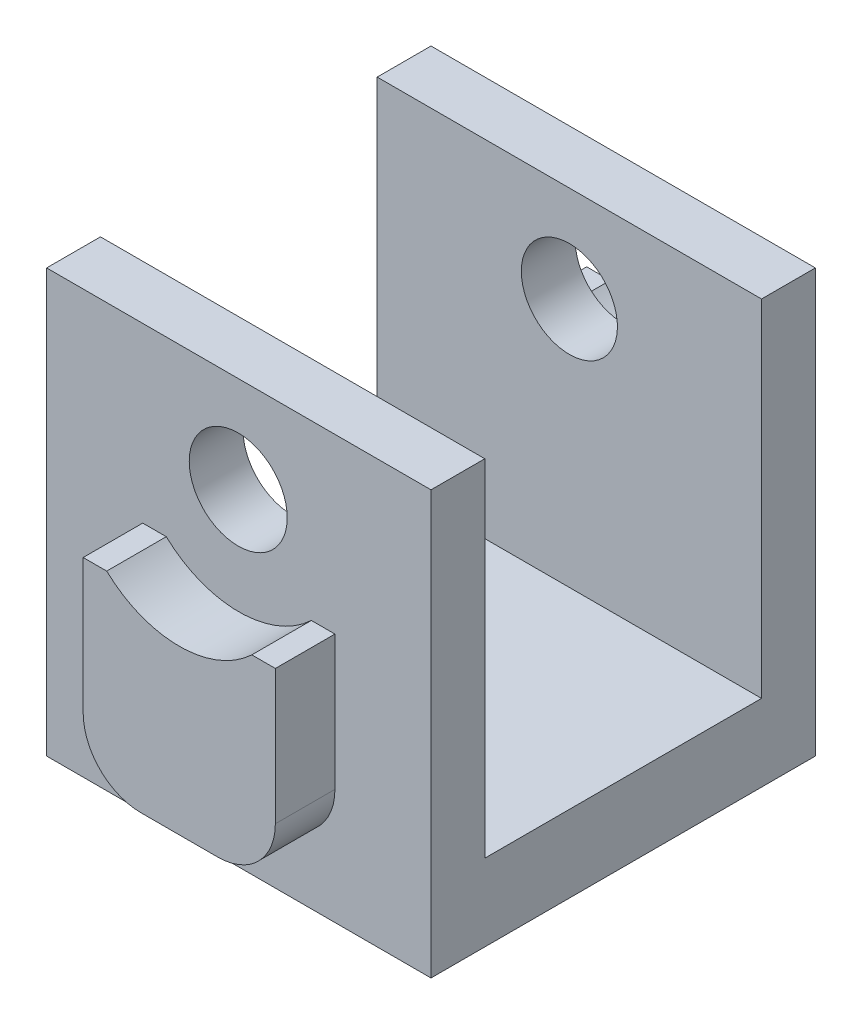
ISO-10303-21;
HEADER;
FILE_DESCRIPTION(('STEP AP214'),'2;1');
FILE_NAME('part.step','',(''),(''),'','','');
FILE_SCHEMA(('AUTOMOTIVE_DESIGN { 1 0 10303 214 1 1 1 1 }'));
ENDSEC;
DATA;
#1=APPLICATION_CONTEXT('core data for automotive mechanical design processes');
#2=APPLICATION_PROTOCOL_DEFINITION('international standard','automotive_design',2000,#1);
#3=PRODUCT_CONTEXT('',#1,'mechanical');
#4=PRODUCT('Part','Part','',(#3));
#5=PRODUCT_RELATED_PRODUCT_CATEGORY('part','',(#4));
#6=PRODUCT_DEFINITION_FORMATION('','',#4);
#7=PRODUCT_DEFINITION_CONTEXT('part definition',#1,'design');
#8=PRODUCT_DEFINITION('design','',#6,#7);
#9=PRODUCT_DEFINITION_SHAPE('','',#8);
#10=(LENGTH_UNIT() NAMED_UNIT(*) SI_UNIT(.MILLI.,.METRE.));
#11=(NAMED_UNIT(*) PLANE_ANGLE_UNIT() SI_UNIT($,.RADIAN.));
#12=(NAMED_UNIT(*) SI_UNIT($,.STERADIAN.) SOLID_ANGLE_UNIT());
#13=UNCERTAINTY_MEASURE_WITH_UNIT(LENGTH_MEASURE(1.E-05),#10,'distance_accuracy_value','');
#14=(GEOMETRIC_REPRESENTATION_CONTEXT(3) GLOBAL_UNCERTAINTY_ASSIGNED_CONTEXT((#13)) GLOBAL_UNIT_ASSIGNED_CONTEXT((#10,
#11,#12)) REPRESENTATION_CONTEXT('',''));
#15=CARTESIAN_POINT('',(0.,0.,0.));
#16=DIRECTION('',(0.,0.,1.));
#17=DIRECTION('',(1.,0.,0.));
#18=AXIS2_PLACEMENT_3D('',#15,#16,#17);
#19=CARTESIAN_POINT('',(10.1,32.,26.));
#20=DIRECTION('',(0.,0.,-1.));
#21=DIRECTION('',(-1.,0.,0.));
#22=AXIS2_PLACEMENT_3D('',#19,#20,#21);
#23=CYLINDRICAL_SURFACE('',#22,5.5);
#24=CARTESIAN_POINT('',(10.1,32.,22.9));
#25=DIRECTION('',(0.,0.,-1.));
#26=DIRECTION('',(1.,0.,0.));
#27=AXIS2_PLACEMENT_3D('',#24,#25,#26);
#28=CIRCLE('',#27,5.5);
#29=CARTESIAN_POINT('',(13.8749172176354,28.,22.9));
#30=VERTEX_POINT('',#29);
#31=CARTESIAN_POINT('',(6.32508278236463,28.,22.9));
#32=VERTEX_POINT('',#31);
#33=EDGE_CURVE('E133',#30,#32,#28,.T.);
#34=ORIENTED_EDGE('',*,*,#33,.T.);
#35=DIRECTION('',(0.,0.,-1.));
#36=VECTOR('',#35,1.);
#37=CARTESIAN_POINT('',(6.32508278236463,28.,26.));
#38=LINE('',#37,#36);
#39=CARTESIAN_POINT('',(6.32508278236463,28.,26.));
#40=VERTEX_POINT('',#39);
#41=EDGE_CURVE('E115',#40,#32,#38,.T.);
#42=ORIENTED_EDGE('',*,*,#41,.F.);
#43=CARTESIAN_POINT('',(10.1,32.,26.));
#44=DIRECTION('',(0.,0.,-1.));
#45=DIRECTION('',(1.,0.,0.));
#46=AXIS2_PLACEMENT_3D('',#43,#44,#45);
#47=CIRCLE('',#46,5.5);
#48=CARTESIAN_POINT('',(13.8749172176354,28.,26.));
#49=VERTEX_POINT('',#48);
#50=EDGE_CURVE('E121',#49,#40,#47,.T.);
#51=ORIENTED_EDGE('',*,*,#50,.F.);
#52=DIRECTION('',(0.,0.,-1.));
#53=VECTOR('',#52,1.);
#54=CARTESIAN_POINT('',(13.8749172176354,28.,26.));
#55=LINE('',#54,#53);
#56=EDGE_CURVE('E180',#49,#30,#55,.T.);
#57=ORIENTED_EDGE('',*,*,#56,.T.);
#58=EDGE_LOOP('',(#34,#42,#51,#57));
#59=FACE_BOUND('',#58,.T.);
#60=ADVANCED_FACE('F44',(#59),#23,.F.);
#61=CARTESIAN_POINT('',(5.1,28.,26.));
#62=DIRECTION('',(0.,-1.,0.));
#63=DIRECTION('',(1.,0.,0.));
#64=AXIS2_PLACEMENT_3D('',#61,#62,#63);
#65=PLANE('',#64);
#66=DIRECTION('',(-1.,0.,0.));
#67=VECTOR('',#66,1.);
#68=CARTESIAN_POINT('',(5.1,28.,22.9));
#69=LINE('',#68,#67);
#70=CARTESIAN_POINT('',(5.1,28.,22.9));
#71=VERTEX_POINT('',#70);
#72=EDGE_CURVE('E175',#32,#71,#69,.T.);
#73=ORIENTED_EDGE('',*,*,#72,.T.);
#74=DIRECTION('',(0.,0.,-1.));
#75=VECTOR('',#74,1.);
#76=CARTESIAN_POINT('',(5.1,28.,26.));
#77=LINE('',#76,#75);
#78=CARTESIAN_POINT('',(5.1,28.,26.));
#79=VERTEX_POINT('',#78);
#80=EDGE_CURVE('E118',#79,#71,#77,.T.);
#81=ORIENTED_EDGE('',*,*,#80,.F.);
#82=DIRECTION('',(-1.,0.,0.));
#83=VECTOR('',#82,1.);
#84=CARTESIAN_POINT('',(5.1,28.,26.));
#85=LINE('',#84,#83);
#86=EDGE_CURVE('E111',#40,#79,#85,.T.);
#87=ORIENTED_EDGE('',*,*,#86,.F.);
#88=ORIENTED_EDGE('',*,*,#41,.T.);
#89=EDGE_LOOP('',(#73,#81,#87,#88));
#90=FACE_BOUND('',#89,.T.);
#91=ADVANCED_FACE('F113',(#90),#65,.F.);
#92=CARTESIAN_POINT('',(5.1,18.,26.));
#93=DIRECTION('',(1.,0.,0.));
#94=DIRECTION('',(0.,1.,0.));
#95=AXIS2_PLACEMENT_3D('',#92,#93,#94);
#96=PLANE('',#95);
#97=DIRECTION('',(0.,-1.,0.));
#98=VECTOR('',#97,1.);
#99=CARTESIAN_POINT('',(5.1,18.,22.9));
#100=LINE('',#99,#98);
#101=CARTESIAN_POINT('',(5.1,21.,22.9));
#102=VERTEX_POINT('',#101);
#103=EDGE_CURVE('E172',#71,#102,#100,.T.);
#104=ORIENTED_EDGE('',*,*,#103,.T.);
#105=DIRECTION('',(0.,0.,-1.));
#106=VECTOR('',#105,1.);
#107=CARTESIAN_POINT('',(5.1,21.,26.));
#108=LINE('',#107,#106);
#109=CARTESIAN_POINT('',(5.1,21.,26.));
#110=VERTEX_POINT('',#109);
#111=EDGE_CURVE('E12',#102,#110,#108,.F.);
#112=ORIENTED_EDGE('',*,*,#111,.T.);
#113=DIRECTION('',(0.,-1.,0.));
#114=VECTOR('',#113,1.);
#115=CARTESIAN_POINT('',(5.1,18.,26.));
#116=LINE('',#115,#114);
#117=EDGE_CURVE('E120',#79,#110,#116,.T.);
#118=ORIENTED_EDGE('',*,*,#117,.F.);
#119=ORIENTED_EDGE('',*,*,#80,.T.);
#120=EDGE_LOOP('',(#104,#112,#118,#119));
#121=FACE_BOUND('',#120,.T.);
#122=ADVANCED_FACE('F190',(#121),#96,.F.);
#123=CARTESIAN_POINT('',(15.1,18.,26.));
#124=DIRECTION('',(0.,1.,0.));
#125=DIRECTION('',(0.,0.,1.));
#126=AXIS2_PLACEMENT_3D('',#123,#124,#125);
#127=PLANE('',#126);
#128=DIRECTION('',(1.,0.,0.));
#129=VECTOR('',#128,1.);
#130=CARTESIAN_POINT('',(15.1,18.,22.9));
#131=LINE('',#130,#129);
#132=CARTESIAN_POINT('',(8.1,18.,22.9));
#133=VERTEX_POINT('',#132);
#134=CARTESIAN_POINT('',(12.1,18.,22.9));
#135=VERTEX_POINT('',#134);
#136=EDGE_CURVE('E167',#133,#135,#131,.T.);
#137=ORIENTED_EDGE('',*,*,#136,.T.);
#138=DIRECTION('',(0.,0.,-1.));
#139=VECTOR('',#138,1.);
#140=CARTESIAN_POINT('',(12.1,18.,26.));
#141=LINE('',#140,#139);
#142=CARTESIAN_POINT('',(12.1,18.,26.));
#143=VERTEX_POINT('',#142);
#144=EDGE_CURVE('E65',#135,#143,#141,.F.);
#145=ORIENTED_EDGE('',*,*,#144,.T.);
#146=DIRECTION('',(1.,0.,0.));
#147=VECTOR('',#146,1.);
#148=CARTESIAN_POINT('',(15.1,18.,26.));
#149=LINE('',#148,#147);
#150=CARTESIAN_POINT('',(8.1,18.,26.));
#151=VERTEX_POINT('',#150);
#152=EDGE_CURVE('E155',#151,#143,#149,.T.);
#153=ORIENTED_EDGE('',*,*,#152,.F.);
#154=DIRECTION('',(0.,0.,-1.));
#155=VECTOR('',#154,1.);
#156=CARTESIAN_POINT('',(8.1,18.,26.));
#157=LINE('',#156,#155);
#158=EDGE_CURVE('E146',#151,#133,#157,.T.);
#159=ORIENTED_EDGE('',*,*,#158,.T.);
#160=EDGE_LOOP('',(#137,#145,#153,#159));
#161=FACE_BOUND('',#160,.T.);
#162=ADVANCED_FACE('F170',(#161),#127,.F.);
#163=CARTESIAN_POINT('',(15.1,28.,26.));
#164=DIRECTION('',(-1.,0.,0.));
#165=DIRECTION('',(0.,0.,1.));
#166=AXIS2_PLACEMENT_3D('',#163,#164,#165);
#167=PLANE('',#166);
#168=DIRECTION('',(0.,1.,0.));
#169=VECTOR('',#168,1.);
#170=CARTESIAN_POINT('',(15.1,28.,26.));
#171=LINE('',#170,#169);
#172=CARTESIAN_POINT('',(15.1,21.,26.));
#173=VERTEX_POINT('',#172);
#174=CARTESIAN_POINT('',(15.1,28.,26.));
#175=VERTEX_POINT('',#174);
#176=EDGE_CURVE('E153',#173,#175,#171,.T.);
#177=ORIENTED_EDGE('',*,*,#176,.F.);
#178=DIRECTION('',(0.,0.,-1.));
#179=VECTOR('',#178,1.);
#180=CARTESIAN_POINT('',(15.1,21.,26.));
#181=LINE('',#180,#179);
#182=CARTESIAN_POINT('',(15.1,21.,22.9));
#183=VERTEX_POINT('',#182);
#184=EDGE_CURVE('E134',#173,#183,#181,.T.);
#185=ORIENTED_EDGE('',*,*,#184,.T.);
#186=DIRECTION('',(0.,1.,0.));
#187=VECTOR('',#186,1.);
#188=CARTESIAN_POINT('',(15.1,28.,22.9));
#189=LINE('',#188,#187);
#190=CARTESIAN_POINT('',(15.1,28.,22.9));
#191=VERTEX_POINT('',#190);
#192=EDGE_CURVE('E169',#183,#191,#189,.T.);
#193=ORIENTED_EDGE('',*,*,#192,.T.);
#194=DIRECTION('',(0.,0.,-1.));
#195=VECTOR('',#194,1.);
#196=CARTESIAN_POINT('',(15.1,28.,26.));
#197=LINE('',#196,#195);
#198=EDGE_CURVE('E139',#175,#191,#197,.T.);
#199=ORIENTED_EDGE('',*,*,#198,.F.);
#200=EDGE_LOOP('',(#177,#185,#193,#199));
#201=FACE_BOUND('',#200,.T.);
#202=ADVANCED_FACE('F159',(#201),#167,.F.);
#203=CARTESIAN_POINT('',(13.8749172176354,28.,26.));
#204=DIRECTION('',(0.,-1.,0.));
#205=DIRECTION('',(1.,0.,0.));
#206=AXIS2_PLACEMENT_3D('',#203,#204,#205);
#207=PLANE('',#206);
#208=DIRECTION('',(-1.,0.,0.));
#209=VECTOR('',#208,1.);
#210=CARTESIAN_POINT('',(13.8749172176354,28.,22.9));
#211=LINE('',#210,#209);
#212=EDGE_CURVE('E130',#191,#30,#211,.T.);
#213=ORIENTED_EDGE('',*,*,#212,.T.);
#214=ORIENTED_EDGE('',*,*,#56,.F.);
#215=DIRECTION('',(-1.,0.,0.));
#216=VECTOR('',#215,1.);
#217=CARTESIAN_POINT('',(13.8749172176354,28.,26.));
#218=LINE('',#217,#216);
#219=EDGE_CURVE('E126',#175,#49,#218,.T.);
#220=ORIENTED_EDGE('',*,*,#219,.F.);
#221=ORIENTED_EDGE('',*,*,#198,.T.);
#222=EDGE_LOOP('',(#213,#214,#220,#221));
#223=FACE_BOUND('',#222,.T.);
#224=ADVANCED_FACE('F182',(#223),#207,.F.);
#225=CARTESIAN_POINT('',(10.1,32.,26.));
#226=DIRECTION('',(0.,0.,1.));
#227=DIRECTION('',(1.,0.,0.));
#228=AXIS2_PLACEMENT_3D('',#225,#226,#227);
#229=PLANE('',#228);
#230=ORIENTED_EDGE('',*,*,#152,.T.);
#231=CARTESIAN_POINT('',(12.1,21.,26.));
#232=DIRECTION('',(0.,0.,1.));
#233=DIRECTION('',(1.,0.,0.));
#234=AXIS2_PLACEMENT_3D('',#231,#232,#233);
#235=CIRCLE('',#234,3.);
#236=EDGE_CURVE('E52',#143,#173,#235,.T.);
#237=ORIENTED_EDGE('',*,*,#236,.T.);
#238=ORIENTED_EDGE('',*,*,#176,.T.);
#239=ORIENTED_EDGE('',*,*,#219,.T.);
#240=ORIENTED_EDGE('',*,*,#50,.T.);
#241=ORIENTED_EDGE('',*,*,#86,.T.);
#242=ORIENTED_EDGE('',*,*,#117,.T.);
#243=CARTESIAN_POINT('',(8.1,21.,26.));
#244=DIRECTION('',(0.,0.,1.));
#245=DIRECTION('',(1.,0.,0.));
#246=AXIS2_PLACEMENT_3D('',#243,#244,#245);
#247=CIRCLE('',#246,3.);
#248=EDGE_CURVE('E150',#110,#151,#247,.T.);
#249=ORIENTED_EDGE('',*,*,#248,.T.);
#250=EDGE_LOOP('',(#230,#237,#238,#239,#240,#241,#242,#249));
#251=FACE_BOUND('',#250,.T.);
#252=ADVANCED_FACE('F124',(#251),#229,.T.);
#253=CARTESIAN_POINT('',(10.1,32.,22.9));
#254=DIRECTION('',(0.,0.,1.));
#255=DIRECTION('',(1.,0.,0.));
#256=AXIS2_PLACEMENT_3D('',#253,#254,#255);
#257=PLANE('',#256);
#258=ORIENTED_EDGE('',*,*,#192,.F.);
#259=CARTESIAN_POINT('',(12.1,21.,22.9));
#260=DIRECTION('',(0.,0.,1.));
#261=DIRECTION('',(1.,0.,0.));
#262=AXIS2_PLACEMENT_3D('',#259,#260,#261);
#263=CIRCLE('',#262,3.);
#264=EDGE_CURVE('E144',#183,#135,#263,.F.);
#265=ORIENTED_EDGE('',*,*,#264,.T.);
#266=ORIENTED_EDGE('',*,*,#136,.F.);
#267=CARTESIAN_POINT('',(8.1,21.,22.9));
#268=DIRECTION('',(0.,0.,1.));
#269=DIRECTION('',(1.,0.,0.));
#270=AXIS2_PLACEMENT_3D('',#267,#268,#269);
#271=CIRCLE('',#270,3.);
#272=EDGE_CURVE('E137',#133,#102,#271,.F.);
#273=ORIENTED_EDGE('',*,*,#272,.T.);
#274=ORIENTED_EDGE('',*,*,#103,.F.);
#275=ORIENTED_EDGE('',*,*,#72,.F.);
#276=ORIENTED_EDGE('',*,*,#33,.F.);
#277=ORIENTED_EDGE('',*,*,#212,.F.);
#278=EDGE_LOOP('',(#258,#265,#266,#273,#274,#275,#276,#277));
#279=FACE_BOUND('',#278,.T.);
#280=ADVANCED_FACE('F166',(#279),#257,.F.);
#281=CARTESIAN_POINT('',(12.1,21.,26.));
#282=DIRECTION('',(0.,0.,-1.));
#283=DIRECTION('',(-1.,0.,0.));
#284=AXIS2_PLACEMENT_3D('',#281,#282,#283);
#285=CYLINDRICAL_SURFACE('',#284,3.);
#286=ORIENTED_EDGE('',*,*,#236,.F.);
#287=ORIENTED_EDGE('',*,*,#144,.F.);
#288=ORIENTED_EDGE('',*,*,#264,.F.);
#289=ORIENTED_EDGE('',*,*,#184,.F.);
#290=EDGE_LOOP('',(#286,#287,#288,#289));
#291=FACE_BOUND('',#290,.T.);
#292=ADVANCED_FACE('F163',(#291),#285,.T.);
#293=CARTESIAN_POINT('',(8.1,21.,26.));
#294=DIRECTION('',(0.,0.,-1.));
#295=DIRECTION('',(-1.,0.,0.));
#296=AXIS2_PLACEMENT_3D('',#293,#294,#295);
#297=CYLINDRICAL_SURFACE('',#296,3.);
#298=ORIENTED_EDGE('',*,*,#248,.F.);
#299=ORIENTED_EDGE('',*,*,#111,.F.);
#300=ORIENTED_EDGE('',*,*,#272,.F.);
#301=ORIENTED_EDGE('',*,*,#158,.F.);
#302=EDGE_LOOP('',(#298,#299,#300,#301));
#303=FACE_BOUND('',#302,.T.);
#304=ADVANCED_FACE('F46',(#303),#297,.T.);
#305=CLOSED_SHELL('',(#60,#91,#122,#162,#202,#224,#252,#280,#292,#304));
#306=MANIFOLD_SOLID_BREP('B2',#305);
#307=CARTESIAN_POINT('',(0.100000000000003,15.,2.89999999999999));
#308=DIRECTION('',(0.,0.,-1.));
#309=DIRECTION('',(0.,1.,0.));
#310=AXIS2_PLACEMENT_3D('',#307,#308,#309);
#311=PLANE('',#310);
#312=CARTESIAN_POINT('',(10.1,32.,2.89999999999999));
#313=DIRECTION('',(0.,0.,-1.));
#314=DIRECTION('',(0.,1.,0.));
#315=AXIS2_PLACEMENT_3D('',#312,#313,#314);
#316=CIRCLE('',#315,2.5);
#317=CARTESIAN_POINT('',(10.1,34.5,2.89999999999999));
#318=VERTEX_POINT('',#317);
#319=EDGE_CURVE('E530',#318,#318,#316,.T.);
#320=ORIENTED_EDGE('',*,*,#319,.F.);
#321=EDGE_LOOP('',(#320));
#322=FACE_BOUND('',#321,.T.);
#323=DIRECTION('',(0.,1.,0.));
#324=VECTOR('',#323,1.);
#325=CARTESIAN_POINT('',(20.1,15.,2.89999999999999));
#326=LINE('',#325,#324);
#327=CARTESIAN_POINT('',(20.1,15.,2.89999999999999));
#328=VERTEX_POINT('',#327);
#329=CARTESIAN_POINT('',(20.1,37.,2.89999999999999));
#330=VERTEX_POINT('',#329);
#331=EDGE_CURVE('E434',#328,#330,#326,.T.);
#332=ORIENTED_EDGE('',*,*,#331,.F.);
#333=DIRECTION('',(1.,0.,0.));
#334=VECTOR('',#333,1.);
#335=CARTESIAN_POINT('',(0.100000000000003,15.,2.89999999999999));
#336=LINE('',#335,#334);
#337=CARTESIAN_POINT('',(0.100000000000003,15.,2.89999999999999));
#338=VERTEX_POINT('',#337);
#339=EDGE_CURVE('E467',#338,#328,#336,.T.);
#340=ORIENTED_EDGE('',*,*,#339,.F.);
#341=DIRECTION('',(0.,1.,0.));
#342=VECTOR('',#341,1.);
#343=CARTESIAN_POINT('',(0.100000000000003,15.,2.89999999999999));
#344=LINE('',#343,#342);
#345=CARTESIAN_POINT('',(0.100000000000003,37.,2.89999999999999));
#346=VERTEX_POINT('',#345);
#347=EDGE_CURVE('E441',#338,#346,#344,.T.);
#348=ORIENTED_EDGE('',*,*,#347,.T.);
#349=DIRECTION('',(1.,0.,0.));
#350=VECTOR('',#349,1.);
#351=CARTESIAN_POINT('',(0.100000000000003,37.,2.89999999999999));
#352=LINE('',#351,#350);
#353=EDGE_CURVE('E455',#346,#330,#352,.T.);
#354=ORIENTED_EDGE('',*,*,#353,.T.);
#355=EDGE_LOOP('',(#332,#340,#348,#354));
#356=FACE_BOUND('',#355,.T.);
#357=DIRECTION('',(1.,0.,0.));
#358=VECTOR('',#357,1.);
#359=CARTESIAN_POINT('',(15.1,28.,2.89999999999999));
#360=LINE('',#359,#358);
#361=CARTESIAN_POINT('',(13.8749172176354,28.,2.89999999999999));
#362=VERTEX_POINT('',#361);
#363=CARTESIAN_POINT('',(15.1,28.,2.89999999999999));
#364=VERTEX_POINT('',#363);
#365=EDGE_CURVE('E517',#362,#364,#360,.T.);
#366=ORIENTED_EDGE('',*,*,#365,.F.);
#367=CARTESIAN_POINT('',(10.1,32.,2.89999999999999));
#368=DIRECTION('',(0.,0.,1.));
#369=DIRECTION('',(0.,1.,0.));
#370=AXIS2_PLACEMENT_3D('',#367,#368,#369);
#371=CIRCLE('',#370,5.5);
#372=CARTESIAN_POINT('',(6.32508278236463,28.,2.89999999999999));
#373=VERTEX_POINT('',#372);
#374=EDGE_CURVE('E407',#373,#362,#371,.T.);
#375=ORIENTED_EDGE('',*,*,#374,.F.);
#376=DIRECTION('',(1.,0.,0.));
#377=VECTOR('',#376,1.);
#378=CARTESIAN_POINT('',(6.32508278236463,28.,2.89999999999999));
#379=LINE('',#378,#377);
#380=CARTESIAN_POINT('',(5.1,28.,2.89999999999999));
#381=VERTEX_POINT('',#380);
#382=EDGE_CURVE('E403',#381,#373,#379,.T.);
#383=ORIENTED_EDGE('',*,*,#382,.F.);
#384=DIRECTION('',(0.,1.,0.));
#385=VECTOR('',#384,1.);
#386=CARTESIAN_POINT('',(5.1,28.,2.89999999999999));
#387=LINE('',#386,#385);
#388=CARTESIAN_POINT('',(5.1,21.,2.89999999999999));
#389=VERTEX_POINT('',#388);
#390=EDGE_CURVE('E491',#389,#381,#387,.T.);
#391=ORIENTED_EDGE('',*,*,#390,.F.);
#392=CARTESIAN_POINT('',(8.1,21.,2.89999999999999));
#393=DIRECTION('',(0.,0.,-1.));
#394=DIRECTION('',(0.,1.,0.));
#395=AXIS2_PLACEMENT_3D('',#392,#393,#394);
#396=CIRCLE('',#395,3.);
#397=CARTESIAN_POINT('',(8.1,18.,2.89999999999999));
#398=VERTEX_POINT('',#397);
#399=EDGE_CURVE('E279',#389,#398,#396,.F.);
#400=ORIENTED_EDGE('',*,*,#399,.T.);
#401=DIRECTION('',(-1.,0.,0.));
#402=VECTOR('',#401,1.);
#403=CARTESIAN_POINT('',(5.1,18.,2.89999999999999));
#404=LINE('',#403,#402);
#405=CARTESIAN_POINT('',(12.1,18.,2.89999999999999));
#406=VERTEX_POINT('',#405);
#407=EDGE_CURVE('E489',#406,#398,#404,.T.);
#408=ORIENTED_EDGE('',*,*,#407,.F.);
#409=CARTESIAN_POINT('',(12.1,21.,2.89999999999999));
#410=DIRECTION('',(0.,0.,-1.));
#411=DIRECTION('',(0.,1.,0.));
#412=AXIS2_PLACEMENT_3D('',#409,#410,#411);
#413=CIRCLE('',#412,3.);
#414=CARTESIAN_POINT('',(15.1,21.,2.89999999999999));
#415=VERTEX_POINT('',#414);
#416=EDGE_CURVE('E42',#406,#415,#413,.F.);
#417=ORIENTED_EDGE('',*,*,#416,.T.);
#418=DIRECTION('',(0.,-1.,0.));
#419=VECTOR('',#418,1.);
#420=CARTESIAN_POINT('',(15.1,18.,2.89999999999999));
#421=LINE('',#420,#419);
#422=EDGE_CURVE('E499',#364,#415,#421,.T.);
#423=ORIENTED_EDGE('',*,*,#422,.F.);
#424=EDGE_LOOP('',(#366,#375,#383,#391,#400,#408,#417,#423));
#425=FACE_BOUND('',#424,.T.);
#426=ADVANCED_FACE('F271',(#322,#356,#425),#311,.T.);
#427=CARTESIAN_POINT('',(0.100000000000003,37.,2.89999999999999));
#428=DIRECTION('',(0.,1.,0.));
#429=DIRECTION('',(0.,0.,1.));
#430=AXIS2_PLACEMENT_3D('',#427,#428,#429);
#431=PLANE('',#430);
#432=DIRECTION('',(-1.,0.,0.));
#433=VECTOR('',#432,1.);
#434=CARTESIAN_POINT('',(20.1,37.,20.1));
#435=LINE('',#434,#433);
#436=CARTESIAN_POINT('',(20.1,37.,20.1));
#437=VERTEX_POINT('',#436);
#438=CARTESIAN_POINT('',(0.100000000000003,37.,20.1));
#439=VERTEX_POINT('',#438);
#440=EDGE_CURVE('E426',#437,#439,#435,.T.);
#441=ORIENTED_EDGE('',*,*,#440,.T.);
#442=DIRECTION('',(0.,0.,1.));
#443=VECTOR('',#442,1.);
#444=CARTESIAN_POINT('',(0.100000000000003,37.,2.89999999999999));
#445=LINE('',#444,#443);
#446=CARTESIAN_POINT('',(0.100000000000003,37.,22.9));
#447=VERTEX_POINT('',#446);
#448=EDGE_CURVE('E444',#439,#447,#445,.T.);
#449=ORIENTED_EDGE('',*,*,#448,.T.);
#450=DIRECTION('',(1.,0.,0.));
#451=VECTOR('',#450,1.);
#452=CARTESIAN_POINT('',(0.100000000000003,37.,22.9));
#453=LINE('',#452,#451);
#454=CARTESIAN_POINT('',(20.1,37.,22.9));
#455=VERTEX_POINT('',#454);
#456=EDGE_CURVE('E472',#447,#455,#453,.T.);
#457=ORIENTED_EDGE('',*,*,#456,.T.);
#458=DIRECTION('',(0.,0.,1.));
#459=VECTOR('',#458,1.);
#460=CARTESIAN_POINT('',(20.1,37.,2.89999999999999));
#461=LINE('',#460,#459);
#462=EDGE_CURVE('E458',#437,#455,#461,.T.);
#463=ORIENTED_EDGE('',*,*,#462,.F.);
#464=EDGE_LOOP('',(#441,#449,#457,#463));
#465=FACE_BOUND('',#464,.T.);
#466=ADVANCED_FACE('F567',(#465),#431,.T.);
#467=CARTESIAN_POINT('',(0.100000000000003,15.,22.9));
#468=DIRECTION('',(0.,-1.,0.));
#469=DIRECTION('',(0.,0.,-1.));
#470=AXIS2_PLACEMENT_3D('',#467,#468,#469);
#471=PLANE('',#470);
#472=CARTESIAN_POINT('',(10.1,15.,12.9));
#473=DIRECTION('',(0.,-1.,0.));
#474=DIRECTION('',(0.,0.,-1.));
#475=AXIS2_PLACEMENT_3D('',#472,#473,#474);
#476=CIRCLE('',#475,3.1);
#477=CARTESIAN_POINT('',(10.1,15.,9.8));
#478=VERTEX_POINT('',#477);
#479=EDGE_CURVE('E542',#478,#478,#476,.T.);
#480=ORIENTED_EDGE('',*,*,#479,.F.);
#481=EDGE_LOOP('',(#480));
#482=FACE_BOUND('',#481,.T.);
#483=DIRECTION('',(0.,0.,-1.));
#484=VECTOR('',#483,1.);
#485=CARTESIAN_POINT('',(20.1,15.,22.9));
#486=LINE('',#485,#484);
#487=CARTESIAN_POINT('',(20.1,15.,22.9));
#488=VERTEX_POINT('',#487);
#489=EDGE_CURVE('E445',#488,#328,#486,.T.);
#490=ORIENTED_EDGE('',*,*,#489,.F.);
#491=DIRECTION('',(1.,0.,0.));
#492=VECTOR('',#491,1.);
#493=CARTESIAN_POINT('',(0.100000000000003,15.,22.9));
#494=LINE('',#493,#492);
#495=CARTESIAN_POINT('',(0.100000000000003,15.,22.9));
#496=VERTEX_POINT('',#495);
#497=EDGE_CURVE('E470',#496,#488,#494,.T.);
#498=ORIENTED_EDGE('',*,*,#497,.F.);
#499=DIRECTION('',(0.,0.,-1.));
#500=VECTOR('',#499,1.);
#501=CARTESIAN_POINT('',(0.100000000000003,15.,22.9));
#502=LINE('',#501,#500);
#503=EDGE_CURVE('E452',#496,#338,#502,.T.);
#504=ORIENTED_EDGE('',*,*,#503,.T.);
#505=ORIENTED_EDGE('',*,*,#339,.T.);
#506=EDGE_LOOP('',(#490,#498,#504,#505));
#507=FACE_BOUND('',#506,.T.);
#508=ADVANCED_FACE('F579',(#482,#507),#471,.T.);
#509=CARTESIAN_POINT('',(0.100000000000003,37.,22.9));
#510=DIRECTION('',(0.,0.,1.));
#511=DIRECTION('',(1.,0.,0.));
#512=AXIS2_PLACEMENT_3D('',#509,#510,#511);
#513=PLANE('',#512);
#514=CARTESIAN_POINT('',(10.0693195053206,31.998036709822,22.9));
#515=DIRECTION('',(0.,0.,1.));
#516=DIRECTION('',(1.,0.,0.));
#517=AXIS2_PLACEMENT_3D('',#514,#515,#516);
#518=CIRCLE('',#517,2.55);
#519=CARTESIAN_POINT('',(12.6193195053206,31.998036709822,22.9));
#520=VERTEX_POINT('',#519);
#521=EDGE_CURVE('E545',#520,#520,#518,.T.);
#522=ORIENTED_EDGE('',*,*,#521,.F.);
#523=EDGE_LOOP('',(#522));
#524=FACE_BOUND('',#523,.T.);
#525=DIRECTION('',(0.,-1.,0.));
#526=VECTOR('',#525,1.);
#527=CARTESIAN_POINT('',(20.1,37.,22.9));
#528=LINE('',#527,#526);
#529=EDGE_CURVE('E462',#455,#488,#528,.T.);
#530=ORIENTED_EDGE('',*,*,#529,.F.);
#531=ORIENTED_EDGE('',*,*,#456,.F.);
#532=DIRECTION('',(0.,-1.,0.));
#533=VECTOR('',#532,1.);
#534=CARTESIAN_POINT('',(0.100000000000003,37.,22.9));
#535=LINE('',#534,#533);
#536=EDGE_CURVE('E449',#447,#496,#535,.T.);
#537=ORIENTED_EDGE('',*,*,#536,.T.);
#538=ORIENTED_EDGE('',*,*,#497,.T.);
#539=EDGE_LOOP('',(#530,#531,#537,#538));
#540=FACE_BOUND('',#539,.T.);
#541=ADVANCED_FACE('F575',(#524,#540),#513,.T.);
#542=DIRECTION('',(-1.,0.,0.));
#543=VECTOR('',#542,1.);
#544=CARTESIAN_POINT('',(20.1,37.,5.69999999999999));
#545=LINE('',#544,#543);
#546=CARTESIAN_POINT('',(20.1,37.,5.69999999999999));
#547=VERTEX_POINT('',#546);
#548=CARTESIAN_POINT('',(0.100000000000003,37.,5.69999999999999));
#549=VERTEX_POINT('',#548);
#550=EDGE_CURVE('E437',#547,#549,#545,.T.);
#551=ORIENTED_EDGE('',*,*,#550,.F.);
#552=EDGE_CURVE('E459',#330,#547,#461,.T.);
#553=ORIENTED_EDGE('',*,*,#552,.F.);
#554=ORIENTED_EDGE('',*,*,#353,.F.);
#555=EDGE_CURVE('E446',#346,#549,#445,.T.);
#556=ORIENTED_EDGE('',*,*,#555,.T.);
#557=EDGE_LOOP('',(#551,#553,#554,#556));
#558=FACE_BOUND('',#557,.T.);
#559=ADVANCED_FACE('F585',(#558),#431,.T.);
#560=CARTESIAN_POINT('',(0.100000000000003,0.,0.));
#561=DIRECTION('',(1.,0.,0.));
#562=DIRECTION('',(0.,0.,-1.));
#563=AXIS2_PLACEMENT_3D('',#560,#561,#562);
#564=PLANE('',#563);
#565=ORIENTED_EDGE('',*,*,#448,.F.);
#566=DIRECTION('',(0.,1.,0.));
#567=VECTOR('',#566,1.);
#568=CARTESIAN_POINT('',(0.100000000000003,19.,20.1));
#569=LINE('',#568,#567);
#570=CARTESIAN_POINT('',(0.100000000000003,19.,20.1));
#571=VERTEX_POINT('',#570);
#572=EDGE_CURVE('E409',#571,#439,#569,.T.);
#573=ORIENTED_EDGE('',*,*,#572,.F.);
#574=DIRECTION('',(0.,0.,1.));
#575=VECTOR('',#574,1.);
#576=CARTESIAN_POINT('',(0.100000000000003,19.,5.69999999999999));
#577=LINE('',#576,#575);
#578=CARTESIAN_POINT('',(0.100000000000003,19.,5.69999999999999));
#579=VERTEX_POINT('',#578);
#580=EDGE_CURVE('E421',#579,#571,#577,.T.);
#581=ORIENTED_EDGE('',*,*,#580,.F.);
#582=DIRECTION('',(0.,-1.,0.));
#583=VECTOR('',#582,1.);
#584=CARTESIAN_POINT('',(0.100000000000003,37.,5.69999999999999));
#585=LINE('',#584,#583);
#586=EDGE_CURVE('E411',#549,#579,#585,.T.);
#587=ORIENTED_EDGE('',*,*,#586,.F.);
#588=ORIENTED_EDGE('',*,*,#555,.F.);
#589=ORIENTED_EDGE('',*,*,#347,.F.);
#590=ORIENTED_EDGE('',*,*,#503,.F.);
#591=ORIENTED_EDGE('',*,*,#536,.F.);
#592=EDGE_LOOP('',(#565,#573,#581,#587,#588,#589,#590,#591));
#593=FACE_BOUND('',#592,.T.);
#594=ADVANCED_FACE('F570',(#593),#564,.F.);
#595=CARTESIAN_POINT('',(20.1,0.,0.));
#596=DIRECTION('',(1.,0.,0.));
#597=DIRECTION('',(0.,0.,-1.));
#598=AXIS2_PLACEMENT_3D('',#595,#596,#597);
#599=PLANE('',#598);
#600=DIRECTION('',(0.,1.,0.));
#601=VECTOR('',#600,1.);
#602=CARTESIAN_POINT('',(20.1,19.,20.1));
#603=LINE('',#602,#601);
#604=CARTESIAN_POINT('',(20.1,19.,20.1));
#605=VERTEX_POINT('',#604);
#606=EDGE_CURVE('E417',#605,#437,#603,.T.);
#607=ORIENTED_EDGE('',*,*,#606,.T.);
#608=ORIENTED_EDGE('',*,*,#462,.T.);
#609=ORIENTED_EDGE('',*,*,#529,.T.);
#610=ORIENTED_EDGE('',*,*,#489,.T.);
#611=ORIENTED_EDGE('',*,*,#331,.T.);
#612=ORIENTED_EDGE('',*,*,#552,.T.);
#613=DIRECTION('',(0.,-1.,0.));
#614=VECTOR('',#613,1.);
#615=CARTESIAN_POINT('',(20.1,37.,5.69999999999999));
#616=LINE('',#615,#614);
#617=CARTESIAN_POINT('',(20.1,19.,5.69999999999999));
#618=VERTEX_POINT('',#617);
#619=EDGE_CURVE('E420',#547,#618,#616,.T.);
#620=ORIENTED_EDGE('',*,*,#619,.T.);
#621=DIRECTION('',(0.,0.,1.));
#622=VECTOR('',#621,1.);
#623=CARTESIAN_POINT('',(20.1,19.,5.69999999999999));
#624=LINE('',#623,#622);
#625=EDGE_CURVE('E424',#618,#605,#624,.T.);
#626=ORIENTED_EDGE('',*,*,#625,.T.);
#627=EDGE_LOOP('',(#607,#608,#609,#610,#611,#612,#620,#626));
#628=FACE_BOUND('',#627,.T.);
#629=ADVANCED_FACE('F558',(#628),#599,.T.);
#630=CARTESIAN_POINT('',(20.1,19.,20.1));
#631=DIRECTION('',(0.,0.,1.));
#632=DIRECTION('',(1.,0.,0.));
#633=AXIS2_PLACEMENT_3D('',#630,#631,#632);
#634=PLANE('',#633);
#635=CARTESIAN_POINT('',(10.0693195053206,31.998036709822,20.1));
#636=DIRECTION('',(0.,0.,-1.));
#637=DIRECTION('',(-1.,0.,0.));
#638=AXIS2_PLACEMENT_3D('',#635,#636,#637);
#639=CIRCLE('',#638,2.55);
#640=CARTESIAN_POINT('',(7.51931950532061,31.998036709822,20.1));
#641=VERTEX_POINT('',#640);
#642=EDGE_CURVE('E548',#641,#641,#639,.T.);
#643=ORIENTED_EDGE('',*,*,#642,.F.);
#644=EDGE_LOOP('',(#643));
#645=FACE_BOUND('',#644,.T.);
#646=ORIENTED_EDGE('',*,*,#572,.T.);
#647=ORIENTED_EDGE('',*,*,#440,.F.);
#648=ORIENTED_EDGE('',*,*,#606,.F.);
#649=DIRECTION('',(-1.,0.,0.));
#650=VECTOR('',#649,1.);
#651=CARTESIAN_POINT('',(20.1,19.,20.1));
#652=LINE('',#651,#650);
#653=EDGE_CURVE('E432',#605,#571,#652,.T.);
#654=ORIENTED_EDGE('',*,*,#653,.T.);
#655=EDGE_LOOP('',(#646,#647,#648,#654));
#656=FACE_BOUND('',#655,.T.);
#657=ADVANCED_FACE('F554',(#645,#656),#634,.F.);
#658=CARTESIAN_POINT('',(20.1,19.,5.69999999999999));
#659=DIRECTION('',(0.,-1.,0.));
#660=DIRECTION('',(0.,0.,-1.));
#661=AXIS2_PLACEMENT_3D('',#658,#659,#660);
#662=PLANE('',#661);
#663=CARTESIAN_POINT('',(10.1,19.,12.9));
#664=DIRECTION('',(0.,-1.,0.));
#665=DIRECTION('',(0.,0.,-1.));
#666=AXIS2_PLACEMENT_3D('',#663,#664,#665);
#667=CIRCLE('',#666,1.2645);
#668=CARTESIAN_POINT('',(10.1,19.,11.6355));
#669=VERTEX_POINT('',#668);
#670=EDGE_CURVE('E533',#669,#669,#667,.T.);
#671=ORIENTED_EDGE('',*,*,#670,.T.);
#672=EDGE_LOOP('',(#671));
#673=FACE_BOUND('',#672,.T.);
#674=ORIENTED_EDGE('',*,*,#580,.T.);
#675=ORIENTED_EDGE('',*,*,#653,.F.);
#676=ORIENTED_EDGE('',*,*,#625,.F.);
#677=DIRECTION('',(-1.,0.,0.));
#678=VECTOR('',#677,1.);
#679=CARTESIAN_POINT('',(20.1,19.,5.69999999999999));
#680=LINE('',#679,#678);
#681=EDGE_CURVE('E435',#618,#579,#680,.T.);
#682=ORIENTED_EDGE('',*,*,#681,.T.);
#683=EDGE_LOOP('',(#674,#675,#676,#682));
#684=FACE_BOUND('',#683,.T.);
#685=ADVANCED_FACE('F557',(#673,#684),#662,.F.);
#686=CARTESIAN_POINT('',(20.1,37.,5.69999999999999));
#687=DIRECTION('',(0.,0.,-1.));
#688=DIRECTION('',(-1.,0.,0.));
#689=AXIS2_PLACEMENT_3D('',#686,#687,#688);
#690=PLANE('',#689);
#691=CARTESIAN_POINT('',(10.1,32.,5.69999999999999));
#692=DIRECTION('',(0.,0.,-1.));
#693=DIRECTION('',(-1.,0.,0.));
#694=AXIS2_PLACEMENT_3D('',#691,#692,#693);
#695=CIRCLE('',#694,2.5);
#696=CARTESIAN_POINT('',(7.6,32.,5.69999999999999));
#697=VERTEX_POINT('',#696);
#698=EDGE_CURVE('E518',#697,#697,#695,.T.);
#699=ORIENTED_EDGE('',*,*,#698,.T.);
#700=EDGE_LOOP('',(#699));
#701=FACE_BOUND('',#700,.T.);
#702=ORIENTED_EDGE('',*,*,#586,.T.);
#703=ORIENTED_EDGE('',*,*,#681,.F.);
#704=ORIENTED_EDGE('',*,*,#619,.F.);
#705=ORIENTED_EDGE('',*,*,#550,.T.);
#706=EDGE_LOOP('',(#702,#703,#704,#705));
#707=FACE_BOUND('',#706,.T.);
#708=ADVANCED_FACE('F589',(#701,#707),#690,.F.);
#709=CARTESIAN_POINT('',(10.1,32.,-0.200000000000015));
#710=DIRECTION('',(0.,0.,1.));
#711=DIRECTION('',(0.,-1.,0.));
#712=AXIS2_PLACEMENT_3D('',#709,#710,#711);
#713=CYLINDRICAL_SURFACE('',#712,5.5);
#714=ORIENTED_EDGE('',*,*,#374,.T.);
#715=DIRECTION('',(0.,0.,1.));
#716=VECTOR('',#715,1.);
#717=CARTESIAN_POINT('',(13.8749172176354,28.,-0.200000000000015));
#718=LINE('',#717,#716);
#719=CARTESIAN_POINT('',(13.8749172176354,28.,-0.200000000000015));
#720=VERTEX_POINT('',#719);
#721=EDGE_CURVE('E387',#720,#362,#718,.T.);
#722=ORIENTED_EDGE('',*,*,#721,.F.);
#723=CARTESIAN_POINT('',(10.1,32.,-0.200000000000015));
#724=DIRECTION('',(0.,0.,1.));
#725=DIRECTION('',(0.,1.,0.));
#726=AXIS2_PLACEMENT_3D('',#723,#724,#725);
#727=CIRCLE('',#726,5.5);
#728=CARTESIAN_POINT('',(6.32508278236463,28.,-0.200000000000015));
#729=VERTEX_POINT('',#728);
#730=EDGE_CURVE('E393',#729,#720,#727,.T.);
#731=ORIENTED_EDGE('',*,*,#730,.F.);
#732=DIRECTION('',(0.,0.,1.));
#733=VECTOR('',#732,1.);
#734=CARTESIAN_POINT('',(6.32508278236463,28.,-0.200000000000015));
#735=LINE('',#734,#733);
#736=EDGE_CURVE('E511',#729,#373,#735,.T.);
#737=ORIENTED_EDGE('',*,*,#736,.T.);
#738=EDGE_LOOP('',(#714,#722,#731,#737));
#739=FACE_BOUND('',#738,.T.);
#740=ADVANCED_FACE('F405',(#739),#713,.F.);
#741=CARTESIAN_POINT('',(15.1,28.,-0.200000000000015));
#742=DIRECTION('',(0.,-1.,0.));
#743=DIRECTION('',(1.,0.,0.));
#744=AXIS2_PLACEMENT_3D('',#741,#742,#743);
#745=PLANE('',#744);
#746=ORIENTED_EDGE('',*,*,#365,.T.);
#747=DIRECTION('',(0.,0.,1.));
#748=VECTOR('',#747,1.);
#749=CARTESIAN_POINT('',(15.1,28.,-0.200000000000015));
#750=LINE('',#749,#748);
#751=CARTESIAN_POINT('',(15.1,28.,-0.200000000000015));
#752=VERTEX_POINT('',#751);
#753=EDGE_CURVE('E390',#752,#364,#750,.T.);
#754=ORIENTED_EDGE('',*,*,#753,.F.);
#755=DIRECTION('',(1.,0.,0.));
#756=VECTOR('',#755,1.);
#757=CARTESIAN_POINT('',(15.1,28.,-0.200000000000015));
#758=LINE('',#757,#756);
#759=EDGE_CURVE('E383',#720,#752,#758,.T.);
#760=ORIENTED_EDGE('',*,*,#759,.F.);
#761=ORIENTED_EDGE('',*,*,#721,.T.);
#762=EDGE_LOOP('',(#746,#754,#760,#761));
#763=FACE_BOUND('',#762,.T.);
#764=ADVANCED_FACE('F385',(#763),#745,.F.);
#765=CARTESIAN_POINT('',(15.1,18.,-0.200000000000015));
#766=DIRECTION('',(-1.,0.,0.));
#767=DIRECTION('',(0.,-1.,0.));
#768=AXIS2_PLACEMENT_3D('',#765,#766,#767);
#769=PLANE('',#768);
#770=ORIENTED_EDGE('',*,*,#422,.T.);
#771=DIRECTION('',(0.,0.,1.));
#772=VECTOR('',#771,1.);
#773=CARTESIAN_POINT('',(15.1,21.,-0.200000000000015));
#774=LINE('',#773,#772);
#775=CARTESIAN_POINT('',(15.1,21.,-0.200000000000015));
#776=VERTEX_POINT('',#775);
#777=EDGE_CURVE('E291',#415,#776,#774,.F.);
#778=ORIENTED_EDGE('',*,*,#777,.T.);
#779=DIRECTION('',(0.,-1.,0.));
#780=VECTOR('',#779,1.);
#781=CARTESIAN_POINT('',(15.1,18.,-0.200000000000015));
#782=LINE('',#781,#780);
#783=EDGE_CURVE('E392',#752,#776,#782,.T.);
#784=ORIENTED_EDGE('',*,*,#783,.F.);
#785=ORIENTED_EDGE('',*,*,#753,.T.);
#786=EDGE_LOOP('',(#770,#778,#784,#785));
#787=FACE_BOUND('',#786,.T.);
#788=ADVANCED_FACE('F525',(#787),#769,.F.);
#789=CARTESIAN_POINT('',(5.1,18.,-0.200000000000015));
#790=DIRECTION('',(0.,1.,0.));
#791=DIRECTION('',(-1.,0.,0.));
#792=AXIS2_PLACEMENT_3D('',#789,#790,#791);
#793=PLANE('',#792);
#794=ORIENTED_EDGE('',*,*,#407,.T.);
#795=DIRECTION('',(0.,0.,1.));
#796=VECTOR('',#795,1.);
#797=CARTESIAN_POINT('',(8.1,18.,-0.200000000000015));
#798=LINE('',#797,#796);
#799=CARTESIAN_POINT('',(8.1,18.,-0.200000000000015));
#800=VERTEX_POINT('',#799);
#801=EDGE_CURVE('E481',#398,#800,#798,.F.);
#802=ORIENTED_EDGE('',*,*,#801,.T.);
#803=DIRECTION('',(-1.,0.,0.));
#804=VECTOR('',#803,1.);
#805=CARTESIAN_POINT('',(5.1,18.,-0.200000000000015));
#806=LINE('',#805,#804);
#807=CARTESIAN_POINT('',(12.1,18.,-0.200000000000015));
#808=VERTEX_POINT('',#807);
#809=EDGE_CURVE('E506',#808,#800,#806,.T.);
#810=ORIENTED_EDGE('',*,*,#809,.F.);
#811=DIRECTION('',(0.,0.,1.));
#812=VECTOR('',#811,1.);
#813=CARTESIAN_POINT('',(12.1,18.,-0.200000000000015));
#814=LINE('',#813,#812);
#815=EDGE_CURVE('E478',#808,#406,#814,.T.);
#816=ORIENTED_EDGE('',*,*,#815,.T.);
#817=EDGE_LOOP('',(#794,#802,#810,#816));
#818=FACE_BOUND('',#817,.T.);
#819=ADVANCED_FACE('F496',(#818),#793,.F.);
#820=CARTESIAN_POINT('',(5.1,28.,-0.200000000000015));
#821=DIRECTION('',(1.,0.,0.));
#822=DIRECTION('',(0.,1.,0.));
#823=AXIS2_PLACEMENT_3D('',#820,#821,#822);
#824=PLANE('',#823);
#825=DIRECTION('',(0.,1.,0.));
#826=VECTOR('',#825,1.);
#827=CARTESIAN_POINT('',(5.1,28.,-0.200000000000015));
#828=LINE('',#827,#826);
#829=CARTESIAN_POINT('',(5.1,21.,-0.200000000000015));
#830=VERTEX_POINT('',#829);
#831=CARTESIAN_POINT('',(5.1,28.,-0.200000000000015));
#832=VERTEX_POINT('',#831);
#833=EDGE_CURVE('E504',#830,#832,#828,.T.);
#834=ORIENTED_EDGE('',*,*,#833,.F.);
#835=DIRECTION('',(0.,0.,1.));
#836=VECTOR('',#835,1.);
#837=CARTESIAN_POINT('',(5.1,21.,-0.200000000000015));
#838=LINE('',#837,#836);
#839=EDGE_CURVE('E469',#830,#389,#838,.T.);
#840=ORIENTED_EDGE('',*,*,#839,.T.);
#841=ORIENTED_EDGE('',*,*,#390,.T.);
#842=DIRECTION('',(0.,0.,1.));
#843=VECTOR('',#842,1.);
#844=CARTESIAN_POINT('',(5.1,28.,-0.200000000000015));
#845=LINE('',#844,#843);
#846=EDGE_CURVE('E413',#832,#381,#845,.T.);
#847=ORIENTED_EDGE('',*,*,#846,.F.);
#848=EDGE_LOOP('',(#834,#840,#841,#847));
#849=FACE_BOUND('',#848,.T.);
#850=ADVANCED_FACE('F508',(#849),#824,.F.);
#851=CARTESIAN_POINT('',(6.32508278236463,28.,-0.200000000000015));
#852=DIRECTION('',(0.,-1.,0.));
#853=DIRECTION('',(1.,0.,0.));
#854=AXIS2_PLACEMENT_3D('',#851,#852,#853);
#855=PLANE('',#854);
#856=ORIENTED_EDGE('',*,*,#382,.T.);
#857=ORIENTED_EDGE('',*,*,#736,.F.);
#858=DIRECTION('',(1.,0.,0.));
#859=VECTOR('',#858,1.);
#860=CARTESIAN_POINT('',(6.32508278236463,28.,-0.200000000000015));
#861=LINE('',#860,#859);
#862=EDGE_CURVE('E399',#832,#729,#861,.T.);
#863=ORIENTED_EDGE('',*,*,#862,.F.);
#864=ORIENTED_EDGE('',*,*,#846,.T.);
#865=EDGE_LOOP('',(#856,#857,#863,#864));
#866=FACE_BOUND('',#865,.T.);
#867=ADVANCED_FACE('F524',(#866),#855,.F.);
#868=CARTESIAN_POINT('',(10.1,32.,-0.200000000000015));
#869=DIRECTION('',(0.,0.,-1.));
#870=DIRECTION('',(0.,1.,0.));
#871=AXIS2_PLACEMENT_3D('',#868,#869,#870);
#872=PLANE('',#871);
#873=ORIENTED_EDGE('',*,*,#809,.T.);
#874=CARTESIAN_POINT('',(8.1,21.,-0.200000000000015));
#875=DIRECTION('',(0.,0.,-1.));
#876=DIRECTION('',(0.,1.,0.));
#877=AXIS2_PLACEMENT_3D('',#874,#875,#876);
#878=CIRCLE('',#877,3.);
#879=EDGE_CURVE('E485',#800,#830,#878,.T.);
#880=ORIENTED_EDGE('',*,*,#879,.T.);
#881=ORIENTED_EDGE('',*,*,#833,.T.);
#882=ORIENTED_EDGE('',*,*,#862,.T.);
#883=ORIENTED_EDGE('',*,*,#730,.T.);
#884=ORIENTED_EDGE('',*,*,#759,.T.);
#885=ORIENTED_EDGE('',*,*,#783,.T.);
#886=CARTESIAN_POINT('',(12.1,21.,-0.200000000000015));
#887=DIRECTION('',(0.,0.,-1.));
#888=DIRECTION('',(0.,1.,0.));
#889=AXIS2_PLACEMENT_3D('',#886,#887,#888);
#890=CIRCLE('',#889,3.);
#891=EDGE_CURVE('E483',#776,#808,#890,.T.);
#892=ORIENTED_EDGE('',*,*,#891,.T.);
#893=EDGE_LOOP('',(#873,#880,#881,#882,#883,#884,#885,#892));
#894=FACE_BOUND('',#893,.T.);
#895=ADVANCED_FACE('F397',(#894),#872,.T.);
#896=CARTESIAN_POINT('',(10.1,32.,2.89999999999999));
#897=DIRECTION('',(0.,0.,-1.));
#898=DIRECTION('',(0.,1.,0.));
#899=AXIS2_PLACEMENT_3D('',#896,#897,#898);
#900=CYLINDRICAL_SURFACE('',#899,2.5);
#901=ORIENTED_EDGE('',*,*,#698,.F.);
#902=EDGE_LOOP('',(#901));
#903=FACE_BOUND('',#902,.T.);
#904=ORIENTED_EDGE('',*,*,#319,.T.);
#905=EDGE_LOOP('',(#904));
#906=FACE_BOUND('',#905,.T.);
#907=ADVANCED_FACE('F632',(#903,#906),#900,.F.);
#908=CARTESIAN_POINT('',(10.1,15.,12.9));
#909=DIRECTION('',(0.,-1.,0.));
#910=DIRECTION('',(0.,0.,-1.));
#911=AXIS2_PLACEMENT_3D('',#908,#909,#910);
#912=CYLINDRICAL_SURFACE('',#911,1.2645);
#913=ORIENTED_EDGE('',*,*,#670,.F.);
#914=EDGE_LOOP('',(#913));
#915=FACE_BOUND('',#914,.T.);
#916=CARTESIAN_POINT('',(10.1,16.,12.9));
#917=DIRECTION('',(0.,-1.,0.));
#918=DIRECTION('',(0.,0.,-1.));
#919=AXIS2_PLACEMENT_3D('',#916,#917,#918);
#920=CIRCLE('',#919,1.2645);
#921=CARTESIAN_POINT('',(10.1,16.,11.6355));
#922=VERTEX_POINT('',#921);
#923=EDGE_CURVE('E536',#922,#922,#920,.T.);
#924=ORIENTED_EDGE('',*,*,#923,.T.);
#925=EDGE_LOOP('',(#924));
#926=FACE_BOUND('',#925,.T.);
#927=ADVANCED_FACE('F623',(#915,#926),#912,.F.);
#928=CARTESIAN_POINT('',(11.3645,16.,12.9));
#929=DIRECTION('',(0.,1.,0.));
#930=DIRECTION('',(0.,0.,1.));
#931=AXIS2_PLACEMENT_3D('',#928,#929,#930);
#932=PLANE('',#931);
#933=ORIENTED_EDGE('',*,*,#923,.F.);
#934=EDGE_LOOP('',(#933));
#935=FACE_BOUND('',#934,.T.);
#936=CARTESIAN_POINT('',(10.1,16.,12.9));
#937=DIRECTION('',(0.,-1.,0.));
#938=DIRECTION('',(0.,0.,-1.));
#939=AXIS2_PLACEMENT_3D('',#936,#937,#938);
#940=CIRCLE('',#939,3.1);
#941=CARTESIAN_POINT('',(10.1,16.,9.8));
#942=VERTEX_POINT('',#941);
#943=EDGE_CURVE('E539',#942,#942,#940,.T.);
#944=ORIENTED_EDGE('',*,*,#943,.T.);
#945=EDGE_LOOP('',(#944));
#946=FACE_BOUND('',#945,.T.);
#947=ADVANCED_FACE('F617',(#935,#946),#932,.F.);
#948=CARTESIAN_POINT('',(10.1,15.,12.9));
#949=DIRECTION('',(0.,-1.,0.));
#950=DIRECTION('',(0.,0.,-1.));
#951=AXIS2_PLACEMENT_3D('',#948,#949,#950);
#952=CYLINDRICAL_SURFACE('',#951,3.1);
#953=ORIENTED_EDGE('',*,*,#943,.F.);
#954=EDGE_LOOP('',(#953));
#955=FACE_BOUND('',#954,.T.);
#956=ORIENTED_EDGE('',*,*,#479,.T.);
#957=EDGE_LOOP('',(#956));
#958=FACE_BOUND('',#957,.T.);
#959=ADVANCED_FACE('F611',(#955,#958),#952,.F.);
#960=CARTESIAN_POINT('',(8.1,21.,-0.200000000000015));
#961=DIRECTION('',(0.,0.,1.));
#962=DIRECTION('',(0.,-1.,0.));
#963=AXIS2_PLACEMENT_3D('',#960,#961,#962);
#964=CYLINDRICAL_SURFACE('',#963,3.);
#965=ORIENTED_EDGE('',*,*,#879,.F.);
#966=ORIENTED_EDGE('',*,*,#801,.F.);
#967=ORIENTED_EDGE('',*,*,#399,.F.);
#968=ORIENTED_EDGE('',*,*,#839,.F.);
#969=EDGE_LOOP('',(#965,#966,#967,#968));
#970=FACE_BOUND('',#969,.T.);
#971=ADVANCED_FACE('F502',(#970),#964,.T.);
#972=CARTESIAN_POINT('',(12.1,21.,-0.200000000000015));
#973=DIRECTION('',(0.,0.,1.));
#974=DIRECTION('',(0.,-1.,0.));
#975=AXIS2_PLACEMENT_3D('',#972,#973,#974);
#976=CYLINDRICAL_SURFACE('',#975,3.);
#977=ORIENTED_EDGE('',*,*,#891,.F.);
#978=ORIENTED_EDGE('',*,*,#777,.F.);
#979=ORIENTED_EDGE('',*,*,#416,.F.);
#980=ORIENTED_EDGE('',*,*,#815,.F.);
#981=EDGE_LOOP('',(#977,#978,#979,#980));
#982=FACE_BOUND('',#981,.T.);
#983=ADVANCED_FACE('F273',(#982),#976,.T.);
#984=CARTESIAN_POINT('',(10.0693195053206,31.998036709822,20.1));
#985=DIRECTION('',(0.,0.,-1.));
#986=DIRECTION('',(-1.,0.,0.));
#987=AXIS2_PLACEMENT_3D('',#984,#985,#986);
#988=CYLINDRICAL_SURFACE('',#987,2.55);
#989=ORIENTED_EDGE('',*,*,#521,.T.);
#990=EDGE_LOOP('',(#989));
#991=FACE_BOUND('',#990,.T.);
#992=ORIENTED_EDGE('',*,*,#642,.T.);
#993=EDGE_LOOP('',(#992));
#994=FACE_BOUND('',#993,.T.);
#995=ADVANCED_FACE('F552',(#991,#994),#988,.F.);
#996=CLOSED_SHELL('',(#426,#466,#508,#541,#559,#594,#629,#657,#685,#708,#740,#764,#788,#819,
#850,#867,#895,#907,#927,#947,#959,#971,#983,#995));
#997=MANIFOLD_SOLID_BREP('B6',#996);
#998=ADVANCED_BREP_SHAPE_REPRESENTATION('',(#18,#306,#997),#14);
#999=SHAPE_DEFINITION_REPRESENTATION(#9,#998);
ENDSEC;
END-ISO-10303-21;
